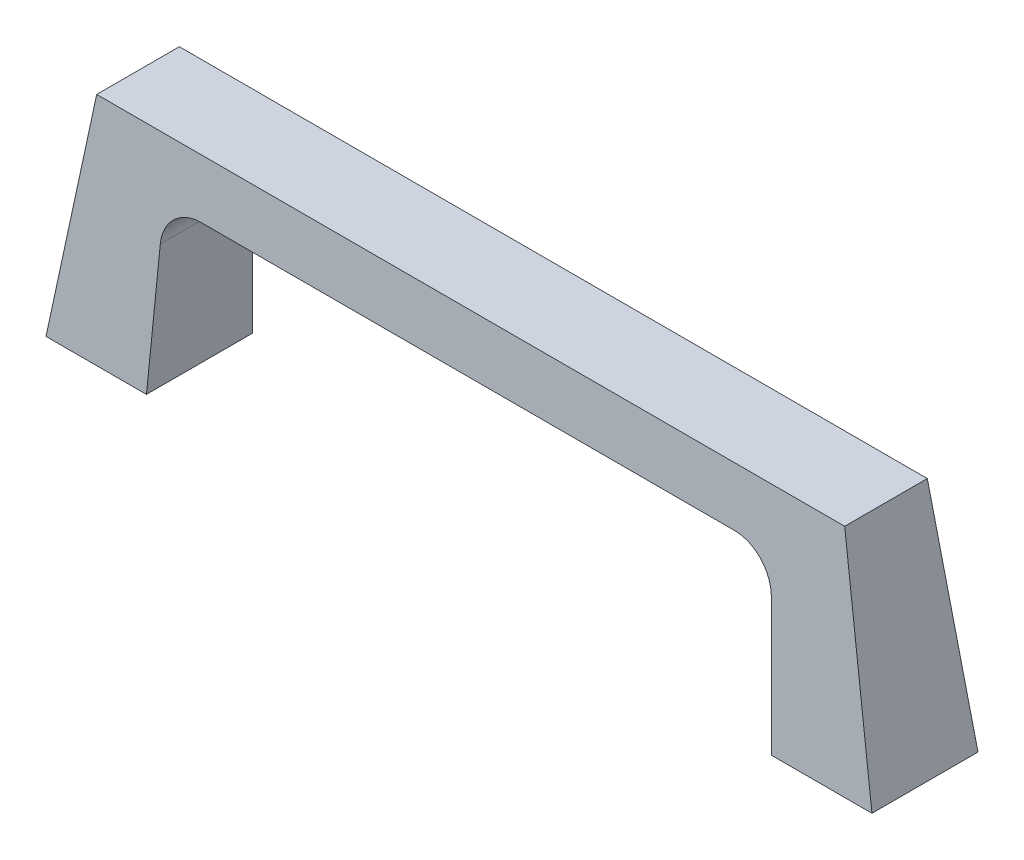
ISO-10303-21;
HEADER;
FILE_DESCRIPTION(('STEP AP214'),'2;1');
FILE_NAME('part.step','',(''),(''),'','','');
FILE_SCHEMA(('AUTOMOTIVE_DESIGN { 1 0 10303 214 1 1 1 1 }'));
ENDSEC;
DATA;
#1=APPLICATION_CONTEXT('core data for automotive mechanical design processes');
#2=APPLICATION_PROTOCOL_DEFINITION('international standard','automotive_design',2000,#1);
#3=PRODUCT_CONTEXT('',#1,'mechanical');
#4=PRODUCT('Part','Part','',(#3));
#5=PRODUCT_RELATED_PRODUCT_CATEGORY('part','',(#4));
#6=PRODUCT_DEFINITION_FORMATION('','',#4);
#7=PRODUCT_DEFINITION_CONTEXT('part definition',#1,'design');
#8=PRODUCT_DEFINITION('design','',#6,#7);
#9=PRODUCT_DEFINITION_SHAPE('','',#8);
#10=(LENGTH_UNIT() NAMED_UNIT(*) SI_UNIT(.MILLI.,.METRE.));
#11=(NAMED_UNIT(*) PLANE_ANGLE_UNIT() SI_UNIT($,.RADIAN.));
#12=(NAMED_UNIT(*) SI_UNIT($,.STERADIAN.) SOLID_ANGLE_UNIT());
#13=UNCERTAINTY_MEASURE_WITH_UNIT(LENGTH_MEASURE(1.E-05),#10,'distance_accuracy_value','');
#14=(GEOMETRIC_REPRESENTATION_CONTEXT(3) GLOBAL_UNCERTAINTY_ASSIGNED_CONTEXT((#13)) GLOBAL_UNIT_ASSIGNED_CONTEXT((#10,
#11,#12)) REPRESENTATION_CONTEXT('',''));
#15=CARTESIAN_POINT('',(0.,0.,0.));
#16=DIRECTION('',(0.,0.,1.));
#17=DIRECTION('',(1.,0.,0.));
#18=AXIS2_PLACEMENT_3D('',#15,#16,#17);
#19=CARTESIAN_POINT('',(-74.,0.,19.));
#20=DIRECTION('',(0.,1.,0.));
#21=DIRECTION('',(-1.,0.,0.));
#22=AXIS2_PLACEMENT_3D('',#19,#20,#21);
#23=PLANE('',#22);
#24=CARTESIAN_POINT('',(-65.,0.,9.5));
#25=DIRECTION('',(0.,-1.,0.));
#26=DIRECTION('',(0.,0.,-1.));
#27=AXIS2_PLACEMENT_3D('',#24,#25,#26);
#28=CIRCLE('',#27,2.5);
#29=CARTESIAN_POINT('',(-65.,0.,7.));
#30=VERTEX_POINT('',#29);
#31=EDGE_CURVE('E138',#30,#30,#28,.T.);
#32=ORIENTED_EDGE('',*,*,#31,.F.);
#33=EDGE_LOOP('',(#32));
#34=FACE_BOUND('',#33,.T.);
#35=DIRECTION('',(-1.,0.,0.));
#36=VECTOR('',#35,1.);
#37=CARTESIAN_POINT('',(-74.,0.,0.));
#38=LINE('',#37,#36);
#39=CARTESIAN_POINT('',(-74.,0.,0.));
#40=VERTEX_POINT('',#39);
#41=CARTESIAN_POINT('',(-56.,0.,0.));
#42=VERTEX_POINT('',#41);
#43=EDGE_CURVE('E149',#40,#42,#38,.F.);
#44=ORIENTED_EDGE('',*,*,#43,.T.);
#45=DIRECTION('',(0.,0.,-1.));
#46=VECTOR('',#45,1.);
#47=CARTESIAN_POINT('',(-56.,0.,19.));
#48=LINE('',#47,#46);
#49=CARTESIAN_POINT('',(-56.,0.,19.));
#50=VERTEX_POINT('',#49);
#51=EDGE_CURVE('E11',#50,#42,#48,.T.);
#52=ORIENTED_EDGE('',*,*,#51,.F.);
#53=DIRECTION('',(1.,0.,0.));
#54=VECTOR('',#53,1.);
#55=CARTESIAN_POINT('',(-74.,0.,19.));
#56=LINE('',#55,#54);
#57=CARTESIAN_POINT('',(-74.,0.,19.));
#58=VERTEX_POINT('',#57);
#59=EDGE_CURVE('E191',#58,#50,#56,.T.);
#60=ORIENTED_EDGE('',*,*,#59,.F.);
#61=DIRECTION('',(0.,0.,-1.));
#62=VECTOR('',#61,1.);
#63=CARTESIAN_POINT('',(-74.,0.,19.));
#64=LINE('',#63,#62);
#65=EDGE_CURVE('E150',#58,#40,#64,.T.);
#66=ORIENTED_EDGE('',*,*,#65,.T.);
#67=EDGE_LOOP('',(#44,#52,#60,#66));
#68=FACE_BOUND('',#67,.T.);
#69=ADVANCED_FACE('F36',(#34,#68),#23,.F.);
#70=CARTESIAN_POINT('',(-54.7431851653011,23.3758164101932,19.));
#71=DIRECTION('',(-0.998557756148269,0.0536880585990368,0.));
#72=DIRECTION('',(-0.0536880585990368,-0.998557756148269,0.));
#73=AXIS2_PLACEMENT_3D('',#70,#71,#72);
#74=PLANE('',#73);
#75=DIRECTION('',(-0.0536146926268001,-0.997193203908423,-0.0522606813329815));
#76=VECTOR('',#75,1.);
#77=CARTESIAN_POINT('',(-54.6933808843934,24.3021388045486,1.27362112657462));
#78=LINE('',#77,#76);
#79=CARTESIAN_POINT('',(-54.7431851653011,23.3758164101932,1.2250746269863));
#80=VERTEX_POINT('',#79);
#81=EDGE_CURVE('E175',#42,#80,#78,.F.);
#82=ORIENTED_EDGE('',*,*,#81,.T.);
#83=DIRECTION('',(0.,0.,-1.));
#84=VECTOR('',#83,1.);
#85=CARTESIAN_POINT('',(-54.7431851653011,23.3758164101932,19.));
#86=LINE('',#85,#84);
#87=CARTESIAN_POINT('',(-54.7431851653011,23.3758164101932,17.7749253730137));
#88=VERTEX_POINT('',#87);
#89=EDGE_CURVE('E46',#88,#80,#86,.T.);
#90=ORIENTED_EDGE('',*,*,#89,.F.);
#91=DIRECTION('',(0.0536146926268001,0.997193203908423,-0.0522606813329815));
#92=VECTOR('',#91,1.);
#93=CARTESIAN_POINT('',(-54.74661775135,23.3119728756681,17.7782712708797));
#94=LINE('',#93,#92);
#95=EDGE_CURVE('E40',#50,#88,#94,.T.);
#96=ORIENTED_EDGE('',*,*,#95,.F.);
#97=ORIENTED_EDGE('',*,*,#51,.T.);
#98=EDGE_LOOP('',(#82,#90,#96,#97));
#99=FACE_BOUND('',#98,.T.);
#100=ADVANCED_FACE('F243',(#99),#74,.F.);
#101=CARTESIAN_POINT('',(-47.7532808722632,23.,19.));
#102=DIRECTION('',(0.,0.,-1.));
#103=DIRECTION('',(-1.,0.,0.));
#104=AXIS2_PLACEMENT_3D('',#101,#102,#103);
#105=CYLINDRICAL_SURFACE('',#104,7.);
#106=CARTESIAN_POINT('',(-47.7532808722632,23.,1.20537892350995));
#107=DIRECTION('',(0.,0.0523359562429439,-0.998629534754574));
#108=DIRECTION('',(0.,-0.998629534754574,-0.052335956242944));
#109=AXIS2_PLACEMENT_3D('',#106,#107,#108);
#110=ELLIPSE('',#109,7.00960642198544,7.);
#111=CARTESIAN_POINT('',(-47.7532808722632,30.,1.57223337849124));
#112=VERTEX_POINT('',#111);
#113=EDGE_CURVE('E177',#80,#112,#110,.T.);
#114=ORIENTED_EDGE('',*,*,#113,.T.);
#115=DIRECTION('',(0.,0.,-1.));
#116=VECTOR('',#115,1.);
#117=CARTESIAN_POINT('',(-47.7532808722632,30.,19.));
#118=LINE('',#117,#116);
#119=CARTESIAN_POINT('',(-47.7532808722632,30.,17.4277666215088));
#120=VERTEX_POINT('',#119);
#121=EDGE_CURVE('E168',#120,#112,#118,.T.);
#122=ORIENTED_EDGE('',*,*,#121,.F.);
#123=CARTESIAN_POINT('',(-47.7532808722632,23.,17.79462107649));
#124=DIRECTION('',(0.,0.0523359562429439,0.998629534754574));
#125=DIRECTION('',(0.,0.998629534754574,-0.052335956242944));
#126=AXIS2_PLACEMENT_3D('',#123,#124,#125);
#127=ELLIPSE('',#126,7.00960642198544,7.);
#128=EDGE_CURVE('E205',#88,#120,#127,.F.);
#129=ORIENTED_EDGE('',*,*,#128,.F.);
#130=ORIENTED_EDGE('',*,*,#89,.T.);
#131=EDGE_LOOP('',(#114,#122,#129,#130));
#132=FACE_BOUND('',#131,.T.);
#133=ADVANCED_FACE('F211',(#132),#105,.F.);
#134=CARTESIAN_POINT('',(47.7532808722632,30.,19.));
#135=DIRECTION('',(0.,1.,0.));
#136=DIRECTION('',(0.,0.,1.));
#137=AXIS2_PLACEMENT_3D('',#134,#135,#136);
#138=PLANE('',#137);
#139=DIRECTION('',(-1.,0.,0.));
#140=VECTOR('',#139,1.);
#141=CARTESIAN_POINT('',(47.7532808722632,30.,1.57223337849124));
#142=LINE('',#141,#140);
#143=CARTESIAN_POINT('',(47.7532808722632,30.,1.57223337849124));
#144=VERTEX_POINT('',#143);
#145=EDGE_CURVE('E179',#112,#144,#142,.F.);
#146=ORIENTED_EDGE('',*,*,#145,.T.);
#147=DIRECTION('',(0.,0.,-1.));
#148=VECTOR('',#147,1.);
#149=CARTESIAN_POINT('',(47.7532808722632,30.,19.));
#150=LINE('',#149,#148);
#151=CARTESIAN_POINT('',(47.7532808722632,30.,17.4277666215088));
#152=VERTEX_POINT('',#151);
#153=EDGE_CURVE('E165',#152,#144,#150,.T.);
#154=ORIENTED_EDGE('',*,*,#153,.F.);
#155=DIRECTION('',(1.,0.,0.));
#156=VECTOR('',#155,1.);
#157=CARTESIAN_POINT('',(47.7532808722632,30.,17.4277666215088));
#158=LINE('',#157,#156);
#159=EDGE_CURVE('E204',#120,#152,#158,.T.);
#160=ORIENTED_EDGE('',*,*,#159,.F.);
#161=ORIENTED_EDGE('',*,*,#121,.T.);
#162=EDGE_LOOP('',(#146,#154,#160,#161));
#163=FACE_BOUND('',#162,.T.);
#164=ADVANCED_FACE('F215',(#163),#138,.F.);
#165=CARTESIAN_POINT('',(47.7532808722632,23.,19.));
#166=DIRECTION('',(0.,0.,-1.));
#167=DIRECTION('',(-1.,0.,0.));
#168=AXIS2_PLACEMENT_3D('',#165,#166,#167);
#169=CYLINDRICAL_SURFACE('',#168,7.);
#170=CARTESIAN_POINT('',(47.7532808722632,23.,1.20537892350995));
#171=DIRECTION('',(0.,0.0523359562429439,-0.998629534754574));
#172=DIRECTION('',(0.,-0.998629534754574,-0.052335956242944));
#173=AXIS2_PLACEMENT_3D('',#170,#171,#172);
#174=ELLIPSE('',#173,7.00960642198544,7.);
#175=CARTESIAN_POINT('',(54.7431851653011,23.3758164101932,1.2250746269863));
#176=VERTEX_POINT('',#175);
#177=EDGE_CURVE('E181',#144,#176,#174,.T.);
#178=ORIENTED_EDGE('',*,*,#177,.T.);
#179=DIRECTION('',(0.,0.,-1.));
#180=VECTOR('',#179,1.);
#181=CARTESIAN_POINT('',(54.7431851653011,23.3758164101932,19.));
#182=LINE('',#181,#180);
#183=CARTESIAN_POINT('',(54.7431851653011,23.3758164101932,17.7749253730137));
#184=VERTEX_POINT('',#183);
#185=EDGE_CURVE('E162',#184,#176,#182,.T.);
#186=ORIENTED_EDGE('',*,*,#185,.F.);
#187=CARTESIAN_POINT('',(47.7532808722632,23.,17.79462107649));
#188=DIRECTION('',(0.,0.0523359562429439,0.998629534754574));
#189=DIRECTION('',(0.,0.998629534754574,-0.052335956242944));
#190=AXIS2_PLACEMENT_3D('',#187,#188,#189);
#191=ELLIPSE('',#190,7.00960642198544,7.);
#192=EDGE_CURVE('E202',#152,#184,#191,.F.);
#193=ORIENTED_EDGE('',*,*,#192,.F.);
#194=ORIENTED_EDGE('',*,*,#153,.T.);
#195=EDGE_LOOP('',(#178,#186,#193,#194));
#196=FACE_BOUND('',#195,.T.);
#197=ADVANCED_FACE('F220',(#196),#169,.F.);
#198=CARTESIAN_POINT('',(54.7431851653011,23.3758164101932,19.));
#199=DIRECTION('',(0.998557756148269,0.0536880585990368,0.));
#200=DIRECTION('',(-0.0536880585990368,0.998557756148269,0.));
#201=AXIS2_PLACEMENT_3D('',#198,#199,#200);
#202=PLANE('',#201);
#203=DIRECTION('',(-0.0536146926268001,0.997193203908423,0.0522606813329815));
#204=VECTOR('',#203,1.);
#205=CARTESIAN_POINT('',(54.6933808843934,24.3021388045486,1.27362112657462));
#206=LINE('',#205,#204);
#207=CARTESIAN_POINT('',(56.,0.,0.));
#208=VERTEX_POINT('',#207);
#209=EDGE_CURVE('E183',#176,#208,#206,.F.);
#210=ORIENTED_EDGE('',*,*,#209,.T.);
#211=DIRECTION('',(0.,0.,-1.));
#212=VECTOR('',#211,1.);
#213=CARTESIAN_POINT('',(56.,0.,19.));
#214=LINE('',#213,#212);
#215=CARTESIAN_POINT('',(56.,0.,19.));
#216=VERTEX_POINT('',#215);
#217=EDGE_CURVE('E159',#216,#208,#214,.T.);
#218=ORIENTED_EDGE('',*,*,#217,.F.);
#219=DIRECTION('',(0.0536146926268001,-0.997193203908423,0.0522606813329815));
#220=VECTOR('',#219,1.);
#221=CARTESIAN_POINT('',(54.74661775135,23.3119728756681,17.7782712708797));
#222=LINE('',#221,#220);
#223=EDGE_CURVE('E200',#184,#216,#222,.T.);
#224=ORIENTED_EDGE('',*,*,#223,.F.);
#225=ORIENTED_EDGE('',*,*,#185,.T.);
#226=EDGE_LOOP('',(#210,#218,#224,#225));
#227=FACE_BOUND('',#226,.T.);
#228=ADVANCED_FACE('F226',(#227),#202,.F.);
#229=CARTESIAN_POINT('',(74.,0.,19.));
#230=DIRECTION('',(0.,1.,0.));
#231=DIRECTION('',(-1.,0.,0.));
#232=AXIS2_PLACEMENT_3D('',#229,#230,#231);
#233=PLANE('',#232);
#234=CARTESIAN_POINT('',(65.,0.,9.5));
#235=DIRECTION('',(0.,-1.,0.));
#236=DIRECTION('',(0.,0.,-1.));
#237=AXIS2_PLACEMENT_3D('',#234,#235,#236);
#238=CIRCLE('',#237,2.5);
#239=CARTESIAN_POINT('',(65.,0.,7.));
#240=VERTEX_POINT('',#239);
#241=EDGE_CURVE('E139',#240,#240,#238,.T.);
#242=ORIENTED_EDGE('',*,*,#241,.F.);
#243=EDGE_LOOP('',(#242));
#244=FACE_BOUND('',#243,.T.);
#245=DIRECTION('',(-1.,0.,0.));
#246=VECTOR('',#245,1.);
#247=CARTESIAN_POINT('',(74.,0.,0.));
#248=LINE('',#247,#246);
#249=CARTESIAN_POINT('',(74.,0.,0.));
#250=VERTEX_POINT('',#249);
#251=EDGE_CURVE('E185',#208,#250,#248,.F.);
#252=ORIENTED_EDGE('',*,*,#251,.T.);
#253=DIRECTION('',(0.,0.,-1.));
#254=VECTOR('',#253,1.);
#255=CARTESIAN_POINT('',(74.,0.,19.));
#256=LINE('',#255,#254);
#257=CARTESIAN_POINT('',(74.,0.,19.));
#258=VERTEX_POINT('',#257);
#259=EDGE_CURVE('E156',#258,#250,#256,.T.);
#260=ORIENTED_EDGE('',*,*,#259,.F.);
#261=DIRECTION('',(1.,0.,0.));
#262=VECTOR('',#261,1.);
#263=CARTESIAN_POINT('',(74.,0.,19.));
#264=LINE('',#263,#262);
#265=EDGE_CURVE('E198',#216,#258,#264,.T.);
#266=ORIENTED_EDGE('',*,*,#265,.F.);
#267=ORIENTED_EDGE('',*,*,#217,.T.);
#268=EDGE_LOOP('',(#252,#260,#266,#267));
#269=FACE_BOUND('',#268,.T.);
#270=ADVANCED_FACE('F230',(#244,#269),#233,.F.);
#271=CARTESIAN_POINT('',(74.,0.,19.));
#272=DIRECTION('',(-0.985087423156484,-0.172054551636738,0.));
#273=DIRECTION('',(0.172054551636738,-0.985087423156484,0.));
#274=AXIS2_PLACEMENT_3D('',#271,#272,#273);
#275=PLANE('',#274);
#276=DIRECTION('',(0.1718257231129,-0.983777279956272,-0.0515575825516191));
#277=VECTOR('',#276,1.);
#278=CARTESIAN_POINT('',(73.8316805408262,0.963702388151294,0.0505055020527737));
#279=LINE('',#278,#277);
#280=CARTESIAN_POINT('',(67.0136332028104,40.,2.09631117132165));
#281=VERTEX_POINT('',#280);
#282=EDGE_CURVE('E187',#250,#281,#279,.F.);
#283=ORIENTED_EDGE('',*,*,#282,.T.);
#284=DIRECTION('',(0.,0.,-1.));
#285=VECTOR('',#284,1.);
#286=CARTESIAN_POINT('',(67.0136332028104,40.,19.));
#287=LINE('',#286,#285);
#288=CARTESIAN_POINT('',(67.0136332028104,40.,16.9036888286783));
#289=VERTEX_POINT('',#288);
#290=EDGE_CURVE('E154',#289,#281,#287,.T.);
#291=ORIENTED_EDGE('',*,*,#290,.F.);
#292=DIRECTION('',(-0.1718257231129,0.983777279956272,-0.0515575825516191));
#293=VECTOR('',#292,1.);
#294=CARTESIAN_POINT('',(74.,0.,19.));
#295=LINE('',#294,#293);
#296=EDGE_CURVE('E196',#258,#289,#295,.T.);
#297=ORIENTED_EDGE('',*,*,#296,.F.);
#298=ORIENTED_EDGE('',*,*,#259,.T.);
#299=EDGE_LOOP('',(#283,#291,#297,#298));
#300=FACE_BOUND('',#299,.T.);
#301=ADVANCED_FACE('F235',(#300),#275,.F.);
#302=CARTESIAN_POINT('',(-67.0136332028104,40.,19.));
#303=DIRECTION('',(0.,-1.,0.));
#304=DIRECTION('',(0.,0.,-1.));
#305=AXIS2_PLACEMENT_3D('',#302,#303,#304);
#306=PLANE('',#305);
#307=DIRECTION('',(1.,0.,0.));
#308=VECTOR('',#307,1.);
#309=CARTESIAN_POINT('',(-67.0136332028104,40.,2.09631117132165));
#310=LINE('',#309,#308);
#311=CARTESIAN_POINT('',(-67.0136332028104,40.,2.09631117132165));
#312=VERTEX_POINT('',#311);
#313=EDGE_CURVE('E97',#281,#312,#310,.F.);
#314=ORIENTED_EDGE('',*,*,#313,.T.);
#315=DIRECTION('',(0.,0.,-1.));
#316=VECTOR('',#315,1.);
#317=CARTESIAN_POINT('',(-67.0136332028104,40.,19.));
#318=LINE('',#317,#316);
#319=CARTESIAN_POINT('',(-67.0136332028104,40.,16.9036888286783));
#320=VERTEX_POINT('',#319);
#321=EDGE_CURVE('E152',#320,#312,#318,.T.);
#322=ORIENTED_EDGE('',*,*,#321,.F.);
#323=DIRECTION('',(-1.,0.,0.));
#324=VECTOR('',#323,1.);
#325=CARTESIAN_POINT('',(-67.0136332028104,40.,16.9036888286783));
#326=LINE('',#325,#324);
#327=EDGE_CURVE('E194',#289,#320,#326,.T.);
#328=ORIENTED_EDGE('',*,*,#327,.F.);
#329=ORIENTED_EDGE('',*,*,#290,.T.);
#330=EDGE_LOOP('',(#314,#322,#328,#329));
#331=FACE_BOUND('',#330,.T.);
#332=ADVANCED_FACE('F237',(#331),#306,.F.);
#333=CARTESIAN_POINT('',(-74.,0.,19.));
#334=DIRECTION('',(0.985087423156484,-0.172054551636738,0.));
#335=DIRECTION('',(0.172054551636738,0.985087423156484,0.));
#336=AXIS2_PLACEMENT_3D('',#333,#334,#335);
#337=PLANE('',#336);
#338=DIRECTION('',(0.1718257231129,0.983777279956272,0.0515575825516191));
#339=VECTOR('',#338,1.);
#340=CARTESIAN_POINT('',(-73.8316805408262,0.963702388151294,0.0505055020527737));
#341=LINE('',#340,#339);
#342=EDGE_CURVE('E89',#312,#40,#341,.F.);
#343=ORIENTED_EDGE('',*,*,#342,.T.);
#344=ORIENTED_EDGE('',*,*,#65,.F.);
#345=DIRECTION('',(-0.1718257231129,-0.983777279956272,0.0515575825516191));
#346=VECTOR('',#345,1.);
#347=CARTESIAN_POINT('',(-74.,0.,19.));
#348=LINE('',#347,#346);
#349=EDGE_CURVE('E55',#320,#58,#348,.T.);
#350=ORIENTED_EDGE('',*,*,#349,.F.);
#351=ORIENTED_EDGE('',*,*,#321,.T.);
#352=EDGE_LOOP('',(#343,#344,#350,#351));
#353=FACE_BOUND('',#352,.T.);
#354=ADVANCED_FACE('F238',(#353),#337,.F.);
#355=CARTESIAN_POINT('',(0.,0.,19.));
#356=DIRECTION('',(0.,0.0523359562429439,0.998629534754574));
#357=DIRECTION('',(0.,-0.998629534754574,0.052335956242944));
#358=AXIS2_PLACEMENT_3D('',#355,#356,#357);
#359=PLANE('',#358);
#360=ORIENTED_EDGE('',*,*,#59,.T.);
#361=ORIENTED_EDGE('',*,*,#95,.T.);
#362=ORIENTED_EDGE('',*,*,#128,.T.);
#363=ORIENTED_EDGE('',*,*,#159,.T.);
#364=ORIENTED_EDGE('',*,*,#192,.T.);
#365=ORIENTED_EDGE('',*,*,#223,.T.);
#366=ORIENTED_EDGE('',*,*,#265,.T.);
#367=ORIENTED_EDGE('',*,*,#296,.T.);
#368=ORIENTED_EDGE('',*,*,#327,.T.);
#369=ORIENTED_EDGE('',*,*,#349,.T.);
#370=EDGE_LOOP('',(#360,#361,#362,#363,#364,#365,#366,#367,#368,#369));
#371=FACE_BOUND('',#370,.T.);
#372=ADVANCED_FACE('F38',(#371),#359,.T.);
#373=CARTESIAN_POINT('',(0.,0.,0.));
#374=DIRECTION('',(0.,0.0523359562429439,-0.998629534754574));
#375=DIRECTION('',(0.,0.998629534754574,0.052335956242944));
#376=AXIS2_PLACEMENT_3D('',#373,#374,#375);
#377=PLANE('',#376);
#378=ORIENTED_EDGE('',*,*,#43,.F.);
#379=ORIENTED_EDGE('',*,*,#342,.F.);
#380=ORIENTED_EDGE('',*,*,#313,.F.);
#381=ORIENTED_EDGE('',*,*,#282,.F.);
#382=ORIENTED_EDGE('',*,*,#251,.F.);
#383=ORIENTED_EDGE('',*,*,#209,.F.);
#384=ORIENTED_EDGE('',*,*,#177,.F.);
#385=ORIENTED_EDGE('',*,*,#145,.F.);
#386=ORIENTED_EDGE('',*,*,#113,.F.);
#387=ORIENTED_EDGE('',*,*,#81,.F.);
#388=EDGE_LOOP('',(#378,#379,#380,#381,#382,#383,#384,#385,#386,#387));
#389=FACE_BOUND('',#388,.T.);
#390=ADVANCED_FACE('F245',(#389),#377,.T.);
#391=CARTESIAN_POINT('',(-65.,15.,9.5));
#392=DIRECTION('',(0.,-1.,0.));
#393=DIRECTION('',(0.,0.,-1.));
#394=AXIS2_PLACEMENT_3D('',#391,#392,#393);
#395=CONICAL_SURFACE('',#394,2.5,1.02974425867665);
#396=CARTESIAN_POINT('',(-65.,16.5021515475689,9.5));
#397=VERTEX_POINT('',#396);
#398=VERTEX_LOOP('',#397);
#399=FACE_BOUND('',#398,.T.);
#400=CARTESIAN_POINT('',(-65.,15.,9.5));
#401=DIRECTION('',(0.,-1.,0.));
#402=DIRECTION('',(0.,0.,-1.));
#403=AXIS2_PLACEMENT_3D('',#400,#401,#402);
#404=CIRCLE('',#403,2.5);
#405=CARTESIAN_POINT('',(-65.,15.,7.));
#406=VERTEX_POINT('',#405);
#407=EDGE_CURVE('E142',#406,#406,#404,.T.);
#408=ORIENTED_EDGE('',*,*,#407,.T.);
#409=EDGE_LOOP('',(#408));
#410=FACE_BOUND('',#409,.T.);
#411=ADVANCED_FACE('F247',(#399,#410),#395,.F.);
#412=CARTESIAN_POINT('',(-65.,0.,9.5));
#413=DIRECTION('',(0.,-1.,0.));
#414=DIRECTION('',(0.,0.,-1.));
#415=AXIS2_PLACEMENT_3D('',#412,#413,#414);
#416=CYLINDRICAL_SURFACE('',#415,2.5);
#417=ORIENTED_EDGE('',*,*,#407,.F.);
#418=EDGE_LOOP('',(#417));
#419=FACE_BOUND('',#418,.T.);
#420=ORIENTED_EDGE('',*,*,#31,.T.);
#421=EDGE_LOOP('',(#420));
#422=FACE_BOUND('',#421,.T.);
#423=ADVANCED_FACE('F132',(#419,#422),#416,.F.);
#424=CARTESIAN_POINT('',(65.,15.,9.5));
#425=DIRECTION('',(0.,-1.,0.));
#426=DIRECTION('',(0.,0.,-1.));
#427=AXIS2_PLACEMENT_3D('',#424,#425,#426);
#428=CONICAL_SURFACE('',#427,2.5,1.02974425867665);
#429=CARTESIAN_POINT('',(65.,16.5021515475689,9.5));
#430=VERTEX_POINT('',#429);
#431=VERTEX_LOOP('',#430);
#432=FACE_BOUND('',#431,.T.);
#433=CARTESIAN_POINT('',(65.,15.,9.5));
#434=DIRECTION('',(0.,-1.,0.));
#435=DIRECTION('',(0.,0.,-1.));
#436=AXIS2_PLACEMENT_3D('',#433,#434,#435);
#437=CIRCLE('',#436,2.5);
#438=CARTESIAN_POINT('',(65.,15.,7.));
#439=VERTEX_POINT('',#438);
#440=EDGE_CURVE('E136',#439,#439,#437,.T.);
#441=ORIENTED_EDGE('',*,*,#440,.T.);
#442=EDGE_LOOP('',(#441));
#443=FACE_BOUND('',#442,.T.);
#444=ADVANCED_FACE('F128',(#432,#443),#428,.F.);
#445=CARTESIAN_POINT('',(65.,0.,9.5));
#446=DIRECTION('',(0.,-1.,0.));
#447=DIRECTION('',(0.,0.,-1.));
#448=AXIS2_PLACEMENT_3D('',#445,#446,#447);
#449=CYLINDRICAL_SURFACE('',#448,2.5);
#450=ORIENTED_EDGE('',*,*,#440,.F.);
#451=EDGE_LOOP('',(#450));
#452=FACE_BOUND('',#451,.T.);
#453=ORIENTED_EDGE('',*,*,#241,.T.);
#454=EDGE_LOOP('',(#453));
#455=FACE_BOUND('',#454,.T.);
#456=ADVANCED_FACE('F131',(#452,#455),#449,.F.);
#457=CLOSED_SHELL('',(#69,#100,#133,#164,#197,#228,#270,#301,#332,#354,#372,#390,#411,#423,#444,#456));
#458=MANIFOLD_SOLID_BREP('B2',#457);
#459=ADVANCED_BREP_SHAPE_REPRESENTATION('',(#18,#458),#14);
#460=SHAPE_DEFINITION_REPRESENTATION(#9,#459);
ENDSEC;
END-ISO-10303-21;
